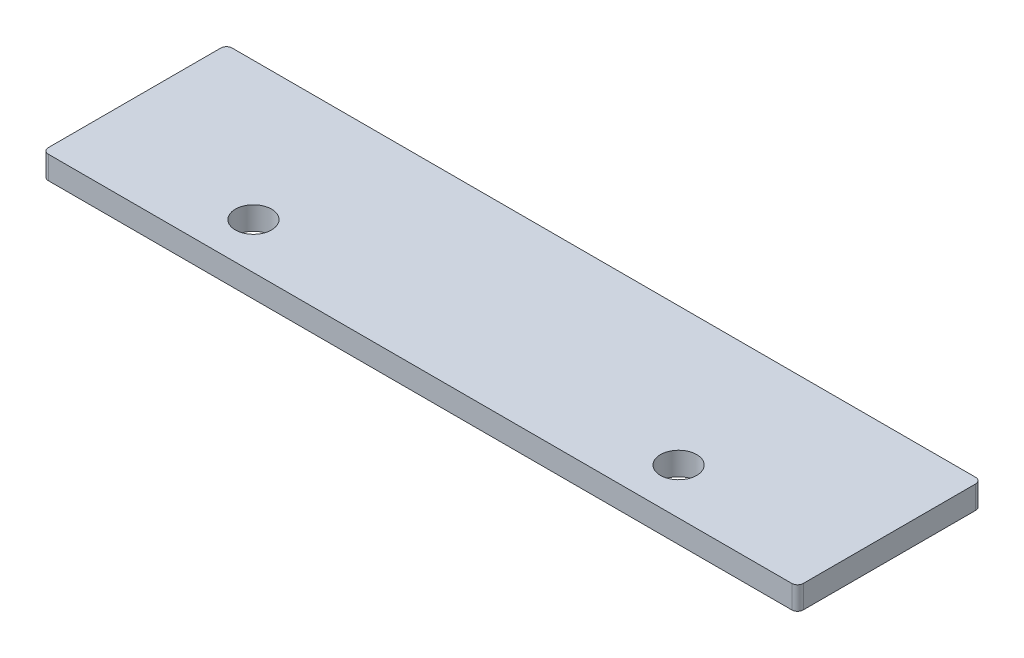
ISO-10303-21;
HEADER;
FILE_DESCRIPTION(('STEP AP214'),'2;1');
FILE_NAME('part.step','',(''),(''),'','','');
FILE_SCHEMA(('AUTOMOTIVE_DESIGN { 1 0 10303 214 1 1 1 1 }'));
ENDSEC;
DATA;
#1=APPLICATION_CONTEXT('core data for automotive mechanical design processes');
#2=APPLICATION_PROTOCOL_DEFINITION('international standard','automotive_design',2000,#1);
#3=PRODUCT_CONTEXT('',#1,'mechanical');
#4=PRODUCT('Part','Part','',(#3));
#5=PRODUCT_RELATED_PRODUCT_CATEGORY('part','',(#4));
#6=PRODUCT_DEFINITION_FORMATION('','',#4);
#7=PRODUCT_DEFINITION_CONTEXT('part definition',#1,'design');
#8=PRODUCT_DEFINITION('design','',#6,#7);
#9=PRODUCT_DEFINITION_SHAPE('','',#8);
#10=(LENGTH_UNIT() NAMED_UNIT(*) SI_UNIT(.MILLI.,.METRE.));
#11=(NAMED_UNIT(*) PLANE_ANGLE_UNIT() SI_UNIT($,.RADIAN.));
#12=(NAMED_UNIT(*) SI_UNIT($,.STERADIAN.) SOLID_ANGLE_UNIT());
#13=UNCERTAINTY_MEASURE_WITH_UNIT(LENGTH_MEASURE(1.E-05),#10,'distance_accuracy_value','');
#14=(GEOMETRIC_REPRESENTATION_CONTEXT(3) GLOBAL_UNCERTAINTY_ASSIGNED_CONTEXT((#13)) GLOBAL_UNIT_ASSIGNED_CONTEXT((#10,
#11,#12)) REPRESENTATION_CONTEXT('',''));
#15=CARTESIAN_POINT('',(0.,0.,0.));
#16=DIRECTION('',(0.,0.,1.));
#17=DIRECTION('',(1.,0.,0.));
#18=AXIS2_PLACEMENT_3D('',#15,#16,#17);
#19=CARTESIAN_POINT('',(32.85,-2.,8.));
#20=DIRECTION('',(1.,0.,0.));
#21=DIRECTION('',(0.,0.,-1.));
#22=AXIS2_PLACEMENT_3D('',#19,#20,#21);
#23=PLANE('',#22);
#24=DIRECTION('',(0.,0.,-1.));
#25=VECTOR('',#24,1.);
#26=CARTESIAN_POINT('',(32.85,-2.,8.));
#27=LINE('',#26,#25);
#28=CARTESIAN_POINT('',(32.85,-2.,7.5));
#29=VERTEX_POINT('',#28);
#30=CARTESIAN_POINT('',(32.85,-2.,-7.5));
#31=VERTEX_POINT('',#30);
#32=EDGE_CURVE('E164',#29,#31,#27,.T.);
#33=ORIENTED_EDGE('',*,*,#32,.T.);
#34=DIRECTION('',(0.,1.,0.));
#35=VECTOR('',#34,1.);
#36=CARTESIAN_POINT('',(32.85,-2.,-7.5));
#37=LINE('',#36,#35);
#38=CARTESIAN_POINT('',(32.85,0.,-7.5));
#39=VERTEX_POINT('',#38);
#40=EDGE_CURVE('E123',#31,#39,#37,.T.);
#41=ORIENTED_EDGE('',*,*,#40,.T.);
#42=DIRECTION('',(0.,0.,-1.));
#43=VECTOR('',#42,1.);
#44=CARTESIAN_POINT('',(32.85,0.,8.));
#45=LINE('',#44,#43);
#46=CARTESIAN_POINT('',(32.85,0.,7.5));
#47=VERTEX_POINT('',#46);
#48=EDGE_CURVE('E107',#47,#39,#45,.T.);
#49=ORIENTED_EDGE('',*,*,#48,.F.);
#50=DIRECTION('',(0.,1.,0.));
#51=VECTOR('',#50,1.);
#52=CARTESIAN_POINT('',(32.85,-2.,7.5));
#53=LINE('',#52,#51);
#54=EDGE_CURVE('E120',#47,#29,#53,.F.);
#55=ORIENTED_EDGE('',*,*,#54,.T.);
#56=EDGE_LOOP('',(#33,#41,#49,#55));
#57=FACE_BOUND('',#56,.T.);
#58=ADVANCED_FACE('F39',(#57),#23,.T.);
#59=CARTESIAN_POINT('',(-32.85,-2.,8.));
#60=DIRECTION('',(0.,0.,1.));
#61=DIRECTION('',(1.,0.,0.));
#62=AXIS2_PLACEMENT_3D('',#59,#60,#61);
#63=PLANE('',#62);
#64=DIRECTION('',(1.,0.,0.));
#65=VECTOR('',#64,1.);
#66=CARTESIAN_POINT('',(-32.85,-2.,8.));
#67=LINE('',#66,#65);
#68=CARTESIAN_POINT('',(-32.35,-2.,8.));
#69=VERTEX_POINT('',#68);
#70=CARTESIAN_POINT('',(32.35,-2.,8.));
#71=VERTEX_POINT('',#70);
#72=EDGE_CURVE('E130',#69,#71,#67,.T.);
#73=ORIENTED_EDGE('',*,*,#72,.T.);
#74=DIRECTION('',(0.,1.,0.));
#75=VECTOR('',#74,1.);
#76=CARTESIAN_POINT('',(32.35,-2.,8.));
#77=LINE('',#76,#75);
#78=CARTESIAN_POINT('',(32.35,0.,8.));
#79=VERTEX_POINT('',#78);
#80=EDGE_CURVE('E156',#71,#79,#77,.T.);
#81=ORIENTED_EDGE('',*,*,#80,.T.);
#82=DIRECTION('',(1.,0.,0.));
#83=VECTOR('',#82,1.);
#84=CARTESIAN_POINT('',(-32.85,0.,8.));
#85=LINE('',#84,#83);
#86=CARTESIAN_POINT('',(-32.35,0.,8.));
#87=VERTEX_POINT('',#86);
#88=EDGE_CURVE('E109',#87,#79,#85,.T.);
#89=ORIENTED_EDGE('',*,*,#88,.F.);
#90=DIRECTION('',(0.,1.,0.));
#91=VECTOR('',#90,1.);
#92=CARTESIAN_POINT('',(-32.35,-2.,8.));
#93=LINE('',#92,#91);
#94=EDGE_CURVE('E154',#87,#69,#93,.F.);
#95=ORIENTED_EDGE('',*,*,#94,.T.);
#96=EDGE_LOOP('',(#73,#81,#89,#95));
#97=FACE_BOUND('',#96,.T.);
#98=ADVANCED_FACE('F207',(#97),#63,.T.);
#99=CARTESIAN_POINT('',(-32.85,-2.,8.));
#100=DIRECTION('',(-1.,0.,0.));
#101=DIRECTION('',(0.,0.,1.));
#102=AXIS2_PLACEMENT_3D('',#99,#100,#101);
#103=PLANE('',#102);
#104=DIRECTION('',(0.,0.,1.));
#105=VECTOR('',#104,1.);
#106=CARTESIAN_POINT('',(-32.85,0.,8.));
#107=LINE('',#106,#105);
#108=CARTESIAN_POINT('',(-32.85,0.,-7.5));
#109=VERTEX_POINT('',#108);
#110=CARTESIAN_POINT('',(-32.85,0.,7.5));
#111=VERTEX_POINT('',#110);
#112=EDGE_CURVE('E161',#109,#111,#107,.T.);
#113=ORIENTED_EDGE('',*,*,#112,.F.);
#114=DIRECTION('',(0.,1.,0.));
#115=VECTOR('',#114,1.);
#116=CARTESIAN_POINT('',(-32.85,-2.,-7.5));
#117=LINE('',#116,#115);
#118=CARTESIAN_POINT('',(-32.85,-2.,-7.5));
#119=VERTEX_POINT('',#118);
#120=EDGE_CURVE('E11',#109,#119,#117,.F.);
#121=ORIENTED_EDGE('',*,*,#120,.T.);
#122=DIRECTION('',(0.,0.,1.));
#123=VECTOR('',#122,1.);
#124=CARTESIAN_POINT('',(-32.85,-2.,8.));
#125=LINE('',#124,#123);
#126=CARTESIAN_POINT('',(-32.85,-2.,7.5));
#127=VERTEX_POINT('',#126);
#128=EDGE_CURVE('E135',#119,#127,#125,.T.);
#129=ORIENTED_EDGE('',*,*,#128,.T.);
#130=DIRECTION('',(0.,1.,0.));
#131=VECTOR('',#130,1.);
#132=CARTESIAN_POINT('',(-32.85,-2.,7.5));
#133=LINE('',#132,#131);
#134=EDGE_CURVE('E47',#127,#111,#133,.T.);
#135=ORIENTED_EDGE('',*,*,#134,.T.);
#136=EDGE_LOOP('',(#113,#121,#129,#135));
#137=FACE_BOUND('',#136,.T.);
#138=ADVANCED_FACE('F160',(#137),#103,.T.);
#139=CARTESIAN_POINT('',(-32.85,-2.,-8.));
#140=DIRECTION('',(0.,0.,-1.));
#141=DIRECTION('',(-1.,0.,0.));
#142=AXIS2_PLACEMENT_3D('',#139,#140,#141);
#143=PLANE('',#142);
#144=DIRECTION('',(-1.,0.,0.));
#145=VECTOR('',#144,1.);
#146=CARTESIAN_POINT('',(-32.85,0.,-8.));
#147=LINE('',#146,#145);
#148=CARTESIAN_POINT('',(32.35,0.,-8.));
#149=VERTEX_POINT('',#148);
#150=CARTESIAN_POINT('',(-32.35,0.,-8.));
#151=VERTEX_POINT('',#150);
#152=EDGE_CURVE('E124',#149,#151,#147,.T.);
#153=ORIENTED_EDGE('',*,*,#152,.F.);
#154=DIRECTION('',(0.,1.,0.));
#155=VECTOR('',#154,1.);
#156=CARTESIAN_POINT('',(32.35,-2.,-8.));
#157=LINE('',#156,#155);
#158=CARTESIAN_POINT('',(32.35,-2.,-8.));
#159=VERTEX_POINT('',#158);
#160=EDGE_CURVE('E146',#149,#159,#157,.F.);
#161=ORIENTED_EDGE('',*,*,#160,.T.);
#162=DIRECTION('',(-1.,0.,0.));
#163=VECTOR('',#162,1.);
#164=CARTESIAN_POINT('',(-32.85,-2.,-8.));
#165=LINE('',#164,#163);
#166=CARTESIAN_POINT('',(-32.35,-2.,-8.));
#167=VERTEX_POINT('',#166);
#168=EDGE_CURVE('E168',#159,#167,#165,.T.);
#169=ORIENTED_EDGE('',*,*,#168,.T.);
#170=DIRECTION('',(0.,1.,0.));
#171=VECTOR('',#170,1.);
#172=CARTESIAN_POINT('',(-32.35,-2.,-8.));
#173=LINE('',#172,#171);
#174=EDGE_CURVE('E143',#167,#151,#173,.T.);
#175=ORIENTED_EDGE('',*,*,#174,.T.);
#176=EDGE_LOOP('',(#153,#161,#169,#175));
#177=FACE_BOUND('',#176,.T.);
#178=ADVANCED_FACE('F216',(#177),#143,.T.);
#179=CARTESIAN_POINT('',(0.,-2.,0.));
#180=DIRECTION('',(0.,-1.,0.));
#181=DIRECTION('',(0.,0.,-1.));
#182=AXIS2_PLACEMENT_3D('',#179,#180,#181);
#183=PLANE('',#182);
#184=CARTESIAN_POINT('',(-18.5,-2.,4.));
#185=DIRECTION('',(0.,1.,0.));
#186=DIRECTION('',(0.,0.,1.));
#187=AXIS2_PLACEMENT_3D('',#184,#185,#186);
#188=CIRCLE('',#187,1.575);
#189=CARTESIAN_POINT('',(-18.5,-2.,5.575));
#190=VERTEX_POINT('',#189);
#191=EDGE_CURVE('E177',#190,#190,#188,.T.);
#192=ORIENTED_EDGE('',*,*,#191,.T.);
#193=EDGE_LOOP('',(#192));
#194=FACE_BOUND('',#193,.T.);
#195=CARTESIAN_POINT('',(18.5,-2.,4.));
#196=DIRECTION('',(0.,1.,0.));
#197=DIRECTION('',(0.,0.,1.));
#198=AXIS2_PLACEMENT_3D('',#195,#196,#197);
#199=CIRCLE('',#198,1.575);
#200=CARTESIAN_POINT('',(18.5,-2.,5.575));
#201=VERTEX_POINT('',#200);
#202=EDGE_CURVE('E125',#201,#201,#199,.T.);
#203=ORIENTED_EDGE('',*,*,#202,.T.);
#204=EDGE_LOOP('',(#203));
#205=FACE_BOUND('',#204,.T.);
#206=ORIENTED_EDGE('',*,*,#168,.F.);
#207=CARTESIAN_POINT('',(32.35,-2.,-7.5));
#208=DIRECTION('',(0.,-1.,0.));
#209=DIRECTION('',(0.,0.,-1.));
#210=AXIS2_PLACEMENT_3D('',#207,#208,#209);
#211=CIRCLE('',#210,0.5);
#212=EDGE_CURVE('E152',#159,#31,#211,.T.);
#213=ORIENTED_EDGE('',*,*,#212,.T.);
#214=ORIENTED_EDGE('',*,*,#32,.F.);
#215=CARTESIAN_POINT('',(32.35,-2.,7.5));
#216=DIRECTION('',(0.,-1.,0.));
#217=DIRECTION('',(0.,0.,-1.));
#218=AXIS2_PLACEMENT_3D('',#215,#216,#217);
#219=CIRCLE('',#218,0.5);
#220=EDGE_CURVE('E129',#29,#71,#219,.T.);
#221=ORIENTED_EDGE('',*,*,#220,.T.);
#222=ORIENTED_EDGE('',*,*,#72,.F.);
#223=CARTESIAN_POINT('',(-32.35,-2.,7.5));
#224=DIRECTION('',(0.,-1.,0.));
#225=DIRECTION('',(0.,0.,-1.));
#226=AXIS2_PLACEMENT_3D('',#223,#224,#225);
#227=CIRCLE('',#226,0.5);
#228=EDGE_CURVE('E54',#69,#127,#227,.T.);
#229=ORIENTED_EDGE('',*,*,#228,.T.);
#230=ORIENTED_EDGE('',*,*,#128,.F.);
#231=CARTESIAN_POINT('',(-32.35,-2.,-7.5));
#232=DIRECTION('',(0.,-1.,0.));
#233=DIRECTION('',(0.,0.,-1.));
#234=AXIS2_PLACEMENT_3D('',#231,#232,#233);
#235=CIRCLE('',#234,0.5);
#236=EDGE_CURVE('E149',#119,#167,#235,.T.);
#237=ORIENTED_EDGE('',*,*,#236,.T.);
#238=EDGE_LOOP('',(#206,#213,#214,#221,#222,#229,#230,#237));
#239=FACE_BOUND('',#238,.T.);
#240=ADVANCED_FACE('F189',(#194,#205,#239),#183,.T.);
#241=CARTESIAN_POINT('',(0.,0.,0.));
#242=DIRECTION('',(0.,-1.,0.));
#243=DIRECTION('',(0.,0.,-1.));
#244=AXIS2_PLACEMENT_3D('',#241,#242,#243);
#245=PLANE('',#244);
#246=CARTESIAN_POINT('',(-18.5,0.,4.));
#247=DIRECTION('',(0.,1.,0.));
#248=DIRECTION('',(0.,0.,1.));
#249=AXIS2_PLACEMENT_3D('',#246,#247,#248);
#250=CIRCLE('',#249,1.575);
#251=CARTESIAN_POINT('',(-18.5,0.,5.575));
#252=VERTEX_POINT('',#251);
#253=EDGE_CURVE('E180',#252,#252,#250,.T.);
#254=ORIENTED_EDGE('',*,*,#253,.F.);
#255=EDGE_LOOP('',(#254));
#256=FACE_BOUND('',#255,.T.);
#257=CARTESIAN_POINT('',(18.5,0.,4.));
#258=DIRECTION('',(0.,1.,0.));
#259=DIRECTION('',(0.,0.,1.));
#260=AXIS2_PLACEMENT_3D('',#257,#258,#259);
#261=CIRCLE('',#260,1.575);
#262=CARTESIAN_POINT('',(18.5,0.,5.575));
#263=VERTEX_POINT('',#262);
#264=EDGE_CURVE('E174',#263,#263,#261,.T.);
#265=ORIENTED_EDGE('',*,*,#264,.F.);
#266=EDGE_LOOP('',(#265));
#267=FACE_BOUND('',#266,.T.);
#268=ORIENTED_EDGE('',*,*,#48,.T.);
#269=CARTESIAN_POINT('',(32.35,0.,-7.5));
#270=DIRECTION('',(0.,-1.,0.));
#271=DIRECTION('',(0.,0.,-1.));
#272=AXIS2_PLACEMENT_3D('',#269,#270,#271);
#273=CIRCLE('',#272,0.5);
#274=EDGE_CURVE('E114',#39,#149,#273,.F.);
#275=ORIENTED_EDGE('',*,*,#274,.T.);
#276=ORIENTED_EDGE('',*,*,#152,.T.);
#277=CARTESIAN_POINT('',(-32.35,0.,-7.5));
#278=DIRECTION('',(0.,-1.,0.));
#279=DIRECTION('',(0.,0.,-1.));
#280=AXIS2_PLACEMENT_3D('',#277,#278,#279);
#281=CIRCLE('',#280,0.5);
#282=EDGE_CURVE('E115',#151,#109,#281,.F.);
#283=ORIENTED_EDGE('',*,*,#282,.T.);
#284=ORIENTED_EDGE('',*,*,#112,.T.);
#285=CARTESIAN_POINT('',(-32.35,0.,7.5));
#286=DIRECTION('',(0.,-1.,0.));
#287=DIRECTION('',(0.,0.,-1.));
#288=AXIS2_PLACEMENT_3D('',#285,#286,#287);
#289=CIRCLE('',#288,0.5);
#290=EDGE_CURVE('E132',#111,#87,#289,.F.);
#291=ORIENTED_EDGE('',*,*,#290,.T.);
#292=ORIENTED_EDGE('',*,*,#88,.T.);
#293=CARTESIAN_POINT('',(32.35,0.,7.5));
#294=DIRECTION('',(0.,-1.,0.));
#295=DIRECTION('',(0.,0.,-1.));
#296=AXIS2_PLACEMENT_3D('',#293,#294,#295);
#297=CIRCLE('',#296,0.5);
#298=EDGE_CURVE('E104',#79,#47,#297,.F.);
#299=ORIENTED_EDGE('',*,*,#298,.T.);
#300=EDGE_LOOP('',(#268,#275,#276,#283,#284,#291,#292,#299));
#301=FACE_BOUND('',#300,.T.);
#302=ADVANCED_FACE('F106',(#256,#267,#301),#245,.F.);
#303=CARTESIAN_POINT('',(32.35,-2.,-7.5));
#304=DIRECTION('',(0.,1.,0.));
#305=DIRECTION('',(0.,0.,1.));
#306=AXIS2_PLACEMENT_3D('',#303,#304,#305);
#307=CYLINDRICAL_SURFACE('',#306,0.5);
#308=ORIENTED_EDGE('',*,*,#212,.F.);
#309=ORIENTED_EDGE('',*,*,#160,.F.);
#310=ORIENTED_EDGE('',*,*,#274,.F.);
#311=ORIENTED_EDGE('',*,*,#40,.F.);
#312=EDGE_LOOP('',(#308,#309,#310,#311));
#313=FACE_BOUND('',#312,.T.);
#314=ADVANCED_FACE('F188',(#313),#307,.T.);
#315=CARTESIAN_POINT('',(32.35,-2.,7.5));
#316=DIRECTION('',(0.,1.,0.));
#317=DIRECTION('',(0.,0.,1.));
#318=AXIS2_PLACEMENT_3D('',#315,#316,#317);
#319=CYLINDRICAL_SURFACE('',#318,0.5);
#320=ORIENTED_EDGE('',*,*,#220,.F.);
#321=ORIENTED_EDGE('',*,*,#54,.F.);
#322=ORIENTED_EDGE('',*,*,#298,.F.);
#323=ORIENTED_EDGE('',*,*,#80,.F.);
#324=EDGE_LOOP('',(#320,#321,#322,#323));
#325=FACE_BOUND('',#324,.T.);
#326=ADVANCED_FACE('F128',(#325),#319,.T.);
#327=CARTESIAN_POINT('',(-32.35,-2.,-7.5));
#328=DIRECTION('',(0.,1.,0.));
#329=DIRECTION('',(0.,0.,1.));
#330=AXIS2_PLACEMENT_3D('',#327,#328,#329);
#331=CYLINDRICAL_SURFACE('',#330,0.5);
#332=ORIENTED_EDGE('',*,*,#236,.F.);
#333=ORIENTED_EDGE('',*,*,#120,.F.);
#334=ORIENTED_EDGE('',*,*,#282,.F.);
#335=ORIENTED_EDGE('',*,*,#174,.F.);
#336=EDGE_LOOP('',(#332,#333,#334,#335));
#337=FACE_BOUND('',#336,.T.);
#338=ADVANCED_FACE('F203',(#337),#331,.T.);
#339=CARTESIAN_POINT('',(-32.35,-2.,7.5));
#340=DIRECTION('',(0.,1.,0.));
#341=DIRECTION('',(0.,0.,1.));
#342=AXIS2_PLACEMENT_3D('',#339,#340,#341);
#343=CYLINDRICAL_SURFACE('',#342,0.5);
#344=ORIENTED_EDGE('',*,*,#228,.F.);
#345=ORIENTED_EDGE('',*,*,#94,.F.);
#346=ORIENTED_EDGE('',*,*,#290,.F.);
#347=ORIENTED_EDGE('',*,*,#134,.F.);
#348=EDGE_LOOP('',(#344,#345,#346,#347));
#349=FACE_BOUND('',#348,.T.);
#350=ADVANCED_FACE('F41',(#349),#343,.T.);
#351=CARTESIAN_POINT('',(18.5,0.,4.));
#352=DIRECTION('',(0.,1.,0.));
#353=DIRECTION('',(0.,0.,1.));
#354=AXIS2_PLACEMENT_3D('',#351,#352,#353);
#355=CYLINDRICAL_SURFACE('',#354,1.575);
#356=ORIENTED_EDGE('',*,*,#202,.F.);
#357=EDGE_LOOP('',(#356));
#358=FACE_BOUND('',#357,.T.);
#359=ORIENTED_EDGE('',*,*,#264,.T.);
#360=EDGE_LOOP('',(#359));
#361=FACE_BOUND('',#360,.T.);
#362=ADVANCED_FACE('F193',(#358,#361),#355,.F.);
#363=CARTESIAN_POINT('',(-18.5,0.,4.));
#364=DIRECTION('',(0.,1.,0.));
#365=DIRECTION('',(0.,0.,1.));
#366=AXIS2_PLACEMENT_3D('',#363,#364,#365);
#367=CYLINDRICAL_SURFACE('',#366,1.575);
#368=ORIENTED_EDGE('',*,*,#191,.F.);
#369=EDGE_LOOP('',(#368));
#370=FACE_BOUND('',#369,.T.);
#371=ORIENTED_EDGE('',*,*,#253,.T.);
#372=EDGE_LOOP('',(#371));
#373=FACE_BOUND('',#372,.T.);
#374=ADVANCED_FACE('F184',(#370,#373),#367,.F.);
#375=CLOSED_SHELL('',(#58,#98,#138,#178,#240,#302,#314,#326,#338,#350,#362,#374));
#376=MANIFOLD_SOLID_BREP('B2',#375);
#377=ADVANCED_BREP_SHAPE_REPRESENTATION('',(#18,#376),#14);
#378=SHAPE_DEFINITION_REPRESENTATION(#9,#377);
ENDSEC;
END-ISO-10303-21;
